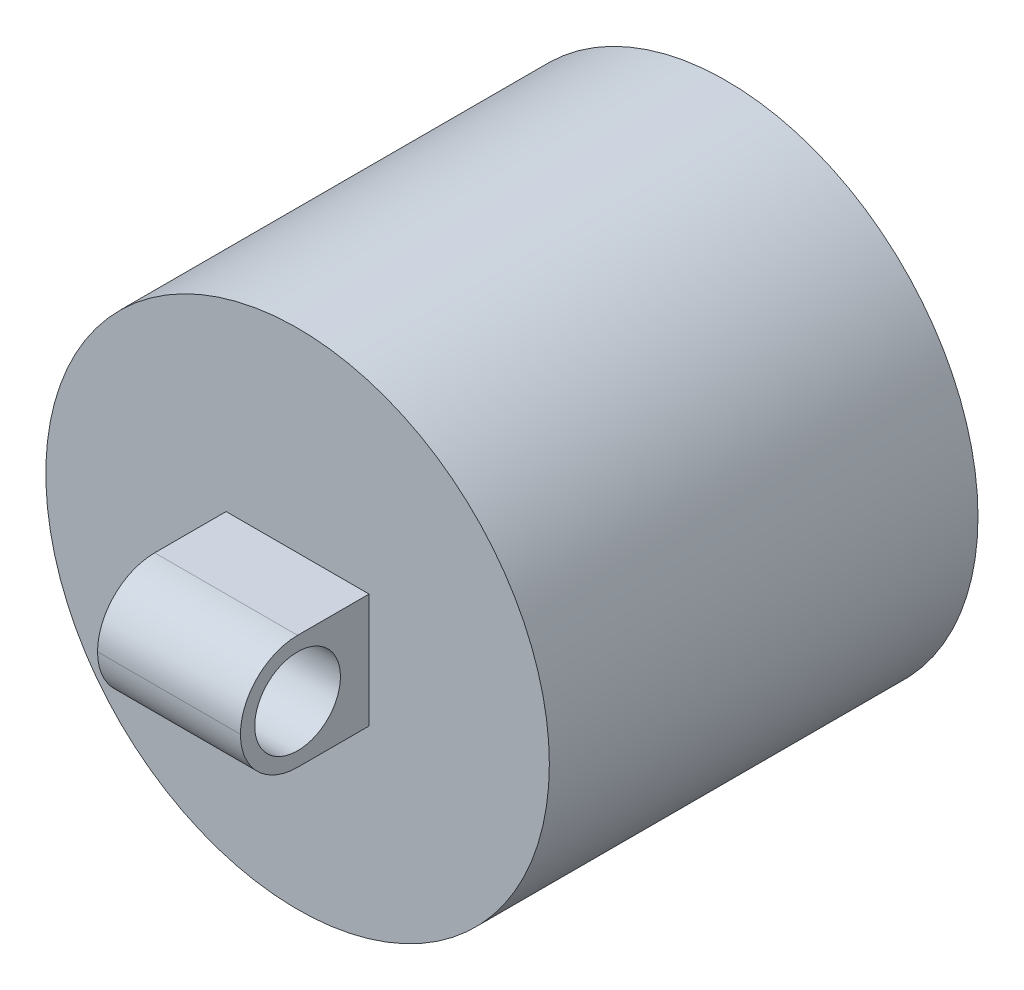
ISO-10303-21;
HEADER;
FILE_DESCRIPTION(('STEP AP214'),'2;1');
FILE_NAME('part.step','',(''),(''),'','','');
FILE_SCHEMA(('AUTOMOTIVE_DESIGN { 1 0 10303 214 1 1 1 1 }'));
ENDSEC;
DATA;
#1=APPLICATION_CONTEXT('core data for automotive mechanical design processes');
#2=APPLICATION_PROTOCOL_DEFINITION('international standard','automotive_design',2000,#1);
#3=PRODUCT_CONTEXT('',#1,'mechanical');
#4=PRODUCT('Part','Part','',(#3));
#5=PRODUCT_RELATED_PRODUCT_CATEGORY('part','',(#4));
#6=PRODUCT_DEFINITION_FORMATION('','',#4);
#7=PRODUCT_DEFINITION_CONTEXT('part definition',#1,'design');
#8=PRODUCT_DEFINITION('design','',#6,#7);
#9=PRODUCT_DEFINITION_SHAPE('','',#8);
#10=(LENGTH_UNIT() NAMED_UNIT(*) SI_UNIT(.MILLI.,.METRE.));
#11=(NAMED_UNIT(*) PLANE_ANGLE_UNIT() SI_UNIT($,.RADIAN.));
#12=(NAMED_UNIT(*) SI_UNIT($,.STERADIAN.) SOLID_ANGLE_UNIT());
#13=UNCERTAINTY_MEASURE_WITH_UNIT(LENGTH_MEASURE(1.E-05),#10,'distance_accuracy_value','');
#14=(GEOMETRIC_REPRESENTATION_CONTEXT(3) GLOBAL_UNCERTAINTY_ASSIGNED_CONTEXT((#13)) GLOBAL_UNIT_ASSIGNED_CONTEXT((#10,
#11,#12)) REPRESENTATION_CONTEXT('',''));
#15=CARTESIAN_POINT('',(0.,0.,0.));
#16=DIRECTION('',(0.,0.,1.));
#17=DIRECTION('',(1.,0.,0.));
#18=AXIS2_PLACEMENT_3D('',#15,#16,#17);
#19=CARTESIAN_POINT('',(0.,0.,15.));
#20=DIRECTION('',(0.,0.,1.));
#21=DIRECTION('',(1.,0.,0.));
#22=AXIS2_PLACEMENT_3D('',#19,#20,#21);
#23=PLANE('',#22);
#24=CARTESIAN_POINT('',(0.,0.,15.));
#25=DIRECTION('',(0.,0.,1.));
#26=DIRECTION('',(1.,0.,0.));
#27=AXIS2_PLACEMENT_3D('',#24,#25,#26);
#28=CIRCLE('',#27,8.81);
#29=CARTESIAN_POINT('',(8.81,0.,15.));
#30=VERTEX_POINT('',#29);
#31=EDGE_CURVE('E123',#30,#30,#28,.T.);
#32=ORIENTED_EDGE('',*,*,#31,.T.);
#33=EDGE_LOOP('',(#32));
#34=FACE_BOUND('',#33,.T.);
#35=DIRECTION('',(0.,1.,0.));
#36=VECTOR('',#35,1.);
#37=CARTESIAN_POINT('',(-2.5,-2.,15.));
#38=LINE('',#37,#36);
#39=CARTESIAN_POINT('',(-2.5,-2.,15.));
#40=VERTEX_POINT('',#39);
#41=CARTESIAN_POINT('',(-2.5,2.,15.));
#42=VERTEX_POINT('',#41);
#43=EDGE_CURVE('E98',#40,#42,#38,.T.);
#44=ORIENTED_EDGE('',*,*,#43,.T.);
#45=DIRECTION('',(1.,0.,0.));
#46=VECTOR('',#45,1.);
#47=CARTESIAN_POINT('',(-2.5,2.,15.));
#48=LINE('',#47,#46);
#49=CARTESIAN_POINT('',(2.5,2.,15.));
#50=VERTEX_POINT('',#49);
#51=EDGE_CURVE('E92',#42,#50,#48,.T.);
#52=ORIENTED_EDGE('',*,*,#51,.T.);
#53=DIRECTION('',(0.,1.,0.));
#54=VECTOR('',#53,1.);
#55=CARTESIAN_POINT('',(2.5,-2.,15.));
#56=LINE('',#55,#54);
#57=CARTESIAN_POINT('',(2.5,-2.,15.));
#58=VERTEX_POINT('',#57);
#59=EDGE_CURVE('E101',#58,#50,#56,.T.);
#60=ORIENTED_EDGE('',*,*,#59,.F.);
#61=DIRECTION('',(1.,0.,0.));
#62=VECTOR('',#61,1.);
#63=CARTESIAN_POINT('',(-2.5,-2.,15.));
#64=LINE('',#63,#62);
#65=EDGE_CURVE('E106',#40,#58,#64,.T.);
#66=ORIENTED_EDGE('',*,*,#65,.F.);
#67=EDGE_LOOP('',(#44,#52,#60,#66));
#68=FACE_BOUND('',#67,.T.);
#69=ADVANCED_FACE('F39',(#34,#68),#23,.T.);
#70=CARTESIAN_POINT('',(0.,0.,15.));
#71=DIRECTION('',(0.,0.,-1.));
#72=DIRECTION('',(-1.,0.,0.));
#73=AXIS2_PLACEMENT_3D('',#70,#71,#72);
#74=CYLINDRICAL_SURFACE('',#73,8.81);
#75=ORIENTED_EDGE('',*,*,#31,.F.);
#76=EDGE_LOOP('',(#75));
#77=FACE_BOUND('',#76,.T.);
#78=CARTESIAN_POINT('',(0.,0.,0.));
#79=DIRECTION('',(0.,0.,1.));
#80=DIRECTION('',(1.,0.,0.));
#81=AXIS2_PLACEMENT_3D('',#78,#79,#80);
#82=CIRCLE('',#81,8.81);
#83=CARTESIAN_POINT('',(8.81,0.,0.));
#84=VERTEX_POINT('',#83);
#85=EDGE_CURVE('E119',#84,#84,#82,.T.);
#86=ORIENTED_EDGE('',*,*,#85,.T.);
#87=EDGE_LOOP('',(#86));
#88=FACE_BOUND('',#87,.T.);
#89=ADVANCED_FACE('F150',(#77,#88),#74,.T.);
#90=CARTESIAN_POINT('',(0.,0.,0.));
#91=DIRECTION('',(0.,0.,1.));
#92=DIRECTION('',(1.,0.,0.));
#93=AXIS2_PLACEMENT_3D('',#90,#91,#92);
#94=PLANE('',#93);
#95=ORIENTED_EDGE('',*,*,#85,.F.);
#96=EDGE_LOOP('',(#95));
#97=FACE_BOUND('',#96,.T.);
#98=ADVANCED_FACE('F156',(#97),#94,.F.);
#99=CARTESIAN_POINT('',(-2.5,2.,19.5));
#100=DIRECTION('',(0.,1.,0.));
#101=DIRECTION('',(0.,0.,1.));
#102=AXIS2_PLACEMENT_3D('',#99,#100,#101);
#103=PLANE('',#102);
#104=DIRECTION('',(0.,0.,-1.));
#105=VECTOR('',#104,1.);
#106=CARTESIAN_POINT('',(-2.5,2.,19.5));
#107=LINE('',#106,#105);
#108=CARTESIAN_POINT('',(-2.5,2.,17.5));
#109=VERTEX_POINT('',#108);
#110=EDGE_CURVE('E117',#109,#42,#107,.T.);
#111=ORIENTED_EDGE('',*,*,#110,.F.);
#112=DIRECTION('',(1.,0.,0.));
#113=VECTOR('',#112,1.);
#114=CARTESIAN_POINT('',(-2.5,2.,17.5));
#115=LINE('',#114,#113);
#116=CARTESIAN_POINT('',(2.5,2.,17.5));
#117=VERTEX_POINT('',#116);
#118=EDGE_CURVE('E95',#109,#117,#115,.T.);
#119=ORIENTED_EDGE('',*,*,#118,.T.);
#120=DIRECTION('',(0.,0.,-1.));
#121=VECTOR('',#120,1.);
#122=CARTESIAN_POINT('',(2.5,2.,19.5));
#123=LINE('',#122,#121);
#124=EDGE_CURVE('E87',#117,#50,#123,.T.);
#125=ORIENTED_EDGE('',*,*,#124,.T.);
#126=ORIENTED_EDGE('',*,*,#51,.F.);
#127=EDGE_LOOP('',(#111,#119,#125,#126));
#128=FACE_BOUND('',#127,.T.);
#129=ADVANCED_FACE('F90',(#128),#103,.T.);
#130=CARTESIAN_POINT('',(-2.5,-2.,19.5));
#131=DIRECTION('',(-1.,0.,0.));
#132=DIRECTION('',(0.,0.,1.));
#133=AXIS2_PLACEMENT_3D('',#130,#131,#132);
#134=PLANE('',#133);
#135=CARTESIAN_POINT('',(-2.5,0.,17.5));
#136=DIRECTION('',(-1.,0.,0.));
#137=DIRECTION('',(0.,0.,1.));
#138=AXIS2_PLACEMENT_3D('',#135,#136,#137);
#139=CIRCLE('',#138,1.5);
#140=CARTESIAN_POINT('',(-2.5,0.,19.));
#141=VERTEX_POINT('',#140);
#142=EDGE_CURVE('E111',#141,#141,#139,.T.);
#143=ORIENTED_EDGE('',*,*,#142,.F.);
#144=EDGE_LOOP('',(#143));
#145=FACE_BOUND('',#144,.T.);
#146=CARTESIAN_POINT('',(-2.5,0.,17.5));
#147=DIRECTION('',(-1.,0.,0.));
#148=DIRECTION('',(0.,0.,1.));
#149=AXIS2_PLACEMENT_3D('',#146,#147,#148);
#150=CIRCLE('',#149,2.);
#151=CARTESIAN_POINT('',(-2.5,-2.,17.5));
#152=VERTEX_POINT('',#151);
#153=CARTESIAN_POINT('',(-2.5,0.,19.5));
#154=VERTEX_POINT('',#153);
#155=EDGE_CURVE('E55',#152,#154,#150,.T.);
#156=ORIENTED_EDGE('',*,*,#155,.T.);
#157=CARTESIAN_POINT('',(-2.5,0.,17.5));
#158=DIRECTION('',(-1.,0.,0.));
#159=DIRECTION('',(0.,0.,1.));
#160=AXIS2_PLACEMENT_3D('',#157,#158,#159);
#161=CIRCLE('',#160,2.);
#162=EDGE_CURVE('E48',#154,#109,#161,.T.);
#163=ORIENTED_EDGE('',*,*,#162,.T.);
#164=ORIENTED_EDGE('',*,*,#110,.T.);
#165=ORIENTED_EDGE('',*,*,#43,.F.);
#166=DIRECTION('',(0.,0.,-1.));
#167=VECTOR('',#166,1.);
#168=CARTESIAN_POINT('',(-2.5,-2.,19.5));
#169=LINE('',#168,#167);
#170=EDGE_CURVE('E120',#152,#40,#169,.T.);
#171=ORIENTED_EDGE('',*,*,#170,.F.);
#172=EDGE_LOOP('',(#156,#163,#164,#165,#171));
#173=FACE_BOUND('',#172,.T.);
#174=ADVANCED_FACE('F135',(#145,#173),#134,.T.);
#175=CARTESIAN_POINT('',(-2.5,-2.,19.5));
#176=DIRECTION('',(0.,1.,0.));
#177=DIRECTION('',(0.,0.,1.));
#178=AXIS2_PLACEMENT_3D('',#175,#176,#177);
#179=PLANE('',#178);
#180=DIRECTION('',(0.,0.,-1.));
#181=VECTOR('',#180,1.);
#182=CARTESIAN_POINT('',(2.5,-2.,19.5));
#183=LINE('',#182,#181);
#184=CARTESIAN_POINT('',(2.5,-2.,17.5));
#185=VERTEX_POINT('',#184);
#186=EDGE_CURVE('E97',#185,#58,#183,.T.);
#187=ORIENTED_EDGE('',*,*,#186,.F.);
#188=DIRECTION('',(1.,0.,0.));
#189=VECTOR('',#188,1.);
#190=CARTESIAN_POINT('',(-2.5,-2.,17.5));
#191=LINE('',#190,#189);
#192=EDGE_CURVE('E11',#185,#152,#191,.F.);
#193=ORIENTED_EDGE('',*,*,#192,.T.);
#194=ORIENTED_EDGE('',*,*,#170,.T.);
#195=ORIENTED_EDGE('',*,*,#65,.T.);
#196=EDGE_LOOP('',(#187,#193,#194,#195));
#197=FACE_BOUND('',#196,.T.);
#198=ADVANCED_FACE('F146',(#197),#179,.F.);
#199=CARTESIAN_POINT('',(2.5,-2.,19.5));
#200=DIRECTION('',(-1.,0.,0.));
#201=DIRECTION('',(0.,0.,1.));
#202=AXIS2_PLACEMENT_3D('',#199,#200,#201);
#203=PLANE('',#202);
#204=CARTESIAN_POINT('',(2.5,0.,17.5));
#205=DIRECTION('',(1.,0.,0.));
#206=DIRECTION('',(0.,0.,-1.));
#207=AXIS2_PLACEMENT_3D('',#204,#205,#206);
#208=CIRCLE('',#207,1.5);
#209=CARTESIAN_POINT('',(2.5,0.,16.));
#210=VERTEX_POINT('',#209);
#211=EDGE_CURVE('E187',#210,#210,#208,.T.);
#212=ORIENTED_EDGE('',*,*,#211,.F.);
#213=EDGE_LOOP('',(#212));
#214=FACE_BOUND('',#213,.T.);
#215=ORIENTED_EDGE('',*,*,#124,.F.);
#216=CARTESIAN_POINT('',(2.5,0.,17.5));
#217=DIRECTION('',(-1.,0.,0.));
#218=DIRECTION('',(0.,0.,1.));
#219=AXIS2_PLACEMENT_3D('',#216,#217,#218);
#220=CIRCLE('',#219,2.);
#221=CARTESIAN_POINT('',(2.5,0.,19.5));
#222=VERTEX_POINT('',#221);
#223=EDGE_CURVE('E131',#117,#222,#220,.F.);
#224=ORIENTED_EDGE('',*,*,#223,.T.);
#225=CARTESIAN_POINT('',(2.5,0.,17.5));
#226=DIRECTION('',(-1.,0.,0.));
#227=DIRECTION('',(0.,0.,1.));
#228=AXIS2_PLACEMENT_3D('',#225,#226,#227);
#229=CIRCLE('',#228,2.);
#230=EDGE_CURVE('E129',#222,#185,#229,.F.);
#231=ORIENTED_EDGE('',*,*,#230,.T.);
#232=ORIENTED_EDGE('',*,*,#186,.T.);
#233=ORIENTED_EDGE('',*,*,#59,.T.);
#234=EDGE_LOOP('',(#215,#224,#231,#232,#233));
#235=FACE_BOUND('',#234,.T.);
#236=ADVANCED_FACE('F102',(#214,#235),#203,.F.);
#237=CARTESIAN_POINT('',(0.,0.,17.5));
#238=DIRECTION('',(-1.,0.,0.));
#239=DIRECTION('',(0.,0.,1.));
#240=AXIS2_PLACEMENT_3D('',#237,#238,#239);
#241=CYLINDRICAL_SURFACE('',#240,2.);
#242=DIRECTION('',(1.,0.,0.));
#243=VECTOR('',#242,1.);
#244=CARTESIAN_POINT('',(2.5,0.,19.5));
#245=LINE('',#244,#243);
#246=EDGE_CURVE('E43',#154,#222,#245,.T.);
#247=ORIENTED_EDGE('',*,*,#246,.F.);
#248=ORIENTED_EDGE('',*,*,#155,.F.);
#249=ORIENTED_EDGE('',*,*,#192,.F.);
#250=ORIENTED_EDGE('',*,*,#230,.F.);
#251=EDGE_LOOP('',(#247,#248,#249,#250));
#252=FACE_BOUND('',#251,.T.);
#253=ADVANCED_FACE('F41',(#252),#241,.T.);
#254=CARTESIAN_POINT('',(-2.5,0.,17.5));
#255=DIRECTION('',(1.,0.,0.));
#256=DIRECTION('',(0.,0.,-1.));
#257=AXIS2_PLACEMENT_3D('',#254,#255,#256);
#258=CYLINDRICAL_SURFACE('',#257,2.);
#259=ORIENTED_EDGE('',*,*,#162,.F.);
#260=ORIENTED_EDGE('',*,*,#246,.T.);
#261=ORIENTED_EDGE('',*,*,#223,.F.);
#262=ORIENTED_EDGE('',*,*,#118,.F.);
#263=EDGE_LOOP('',(#259,#260,#261,#262));
#264=FACE_BOUND('',#263,.T.);
#265=ADVANCED_FACE('F137',(#264),#258,.T.);
#266=CARTESIAN_POINT('',(-8.81,0.,17.5));
#267=DIRECTION('',(1.,0.,0.));
#268=DIRECTION('',(0.,0.,-1.));
#269=AXIS2_PLACEMENT_3D('',#266,#267,#268);
#270=CYLINDRICAL_SURFACE('',#269,1.5);
#271=ORIENTED_EDGE('',*,*,#142,.T.);
#272=EDGE_LOOP('',(#271));
#273=FACE_BOUND('',#272,.T.);
#274=ORIENTED_EDGE('',*,*,#211,.T.);
#275=EDGE_LOOP('',(#274));
#276=FACE_BOUND('',#275,.T.);
#277=ADVANCED_FACE('F145',(#273,#276),#270,.F.);
#278=CLOSED_SHELL('',(#69,#89,#98,#129,#174,#198,#236,#253,#265,#277));
#279=MANIFOLD_SOLID_BREP('B2',#278);
#280=ADVANCED_BREP_SHAPE_REPRESENTATION('',(#18,#279),#14);
#281=SHAPE_DEFINITION_REPRESENTATION(#9,#280);
ENDSEC;
END-ISO-10303-21;
